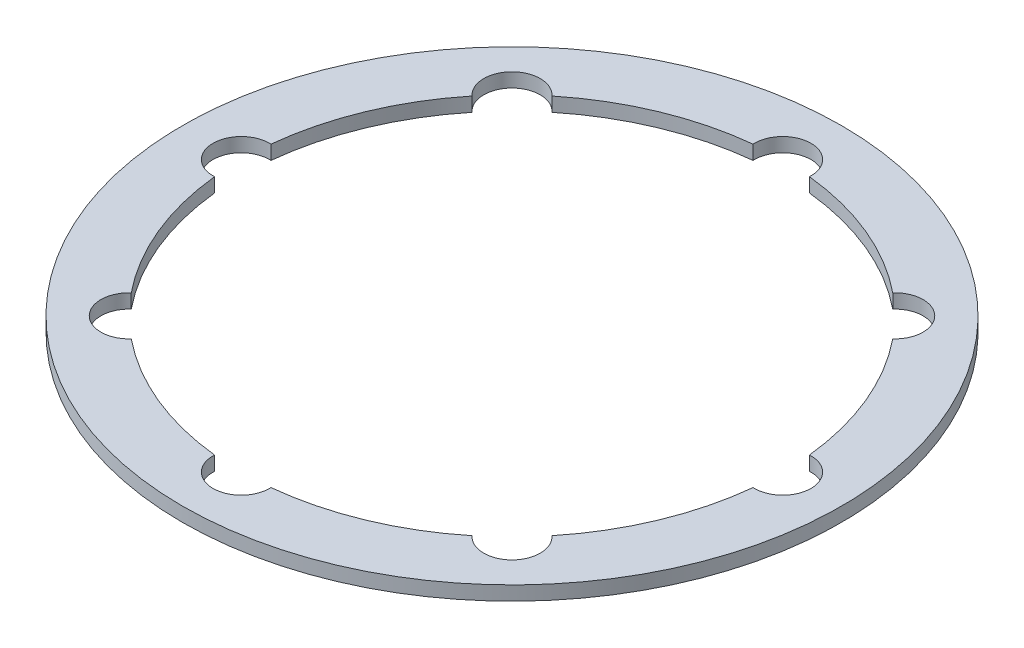
ISO-10303-21;
HEADER;
FILE_DESCRIPTION(('STEP AP214'),'2;1');
FILE_NAME('part.step','',(''),(''),'','','');
FILE_SCHEMA(('AUTOMOTIVE_DESIGN { 1 0 10303 214 1 1 1 1 }'));
ENDSEC;
DATA;
#1=APPLICATION_CONTEXT('core data for automotive mechanical design processes');
#2=APPLICATION_PROTOCOL_DEFINITION('international standard','automotive_design',2000,#1);
#3=PRODUCT_CONTEXT('',#1,'mechanical');
#4=PRODUCT('Part','Part','',(#3));
#5=PRODUCT_RELATED_PRODUCT_CATEGORY('part','',(#4));
#6=PRODUCT_DEFINITION_FORMATION('','',#4);
#7=PRODUCT_DEFINITION_CONTEXT('part definition',#1,'design');
#8=PRODUCT_DEFINITION('design','',#6,#7);
#9=PRODUCT_DEFINITION_SHAPE('','',#8);
#10=(LENGTH_UNIT() NAMED_UNIT(*) SI_UNIT(.MILLI.,.METRE.));
#11=(NAMED_UNIT(*) PLANE_ANGLE_UNIT() SI_UNIT($,.RADIAN.));
#12=(NAMED_UNIT(*) SI_UNIT($,.STERADIAN.) SOLID_ANGLE_UNIT());
#13=UNCERTAINTY_MEASURE_WITH_UNIT(LENGTH_MEASURE(1.E-05),#10,'distance_accuracy_value','');
#14=(GEOMETRIC_REPRESENTATION_CONTEXT(3) GLOBAL_UNCERTAINTY_ASSIGNED_CONTEXT((#13)) GLOBAL_UNIT_ASSIGNED_CONTEXT((#10,
#11,#12)) REPRESENTATION_CONTEXT('',''));
#15=CARTESIAN_POINT('',(0.,0.,0.));
#16=DIRECTION('',(0.,0.,1.));
#17=DIRECTION('',(1.,0.,0.));
#18=AXIS2_PLACEMENT_3D('',#15,#16,#17);
#19=CARTESIAN_POINT('',(0.,3.00000000000011,0.));
#20=DIRECTION('',(0.,1.,0.));
#21=DIRECTION('',(0.,0.,0.999999999999999));
#22=AXIS2_PLACEMENT_3D('',#19,#20,#21);
#23=PLANE('',#22);
#24=CARTESIAN_POINT('',(0.,3.00000000000011,0.));
#25=DIRECTION('',(0.,1.,0.));
#26=DIRECTION('',(0.,0.,0.999999999999999));
#27=AXIS2_PLACEMENT_3D('',#24,#25,#26);
#28=CIRCLE('',#27,70.);
#29=CARTESIAN_POINT('',(0.,3.0000000000001,-70.));
#30=VERTEX_POINT('',#29);
#31=EDGE_CURVE('E11',#30,#30,#28,.T.);
#32=ORIENTED_EDGE('',*,*,#31,.T.);
#33=EDGE_LOOP('',(#32));
#34=FACE_BOUND('',#33,.T.);
#35=CARTESIAN_POINT('',(1.3314002678122E-12,3.00000000000011,-57.4999999999968));
#36=DIRECTION('',(0.,1.,0.));
#37=DIRECTION('',(0.,0.,0.999999999999999));
#38=AXIS2_PLACEMENT_3D('',#35,#36,#37);
#39=CIRCLE('',#38,5.99999999999979);
#40=CARTESIAN_POINT('',(5.99182808337604,2.99999999999967,-57.1869565217391));
#41=VERTEX_POINT('',#40);
#42=CARTESIAN_POINT('',(-5.99182808337409,3.00000000000011,-57.1869565217393));
#43=VERTEX_POINT('',#42);
#44=EDGE_CURVE('E162',#41,#43,#39,.T.);
#45=ORIENTED_EDGE('',*,*,#44,.F.);
#46=CARTESIAN_POINT('',(0.,3.00000000000011,0.));
#47=DIRECTION('',(0.,1.,0.));
#48=DIRECTION('',(0.,0.,0.999999999999999));
#49=AXIS2_PLACEMENT_3D('',#46,#47,#48);
#50=CIRCLE('',#49,57.5);
#51=CARTESIAN_POINT('',(36.2004224824845,3.00000000000011,-44.6741470213994));
#52=VERTEX_POINT('',#51);
#53=EDGE_CURVE('E155',#52,#41,#50,.T.);
#54=ORIENTED_EDGE('',*,*,#53,.F.);
#55=CARTESIAN_POINT('',(40.6586399182254,3.00000000000011,-40.658639918224));
#56=DIRECTION('',(0.,1.,0.));
#57=DIRECTION('',(0.,0.,0.999999999999999));
#58=AXIS2_PLACEMENT_3D('',#55,#56,#57);
#59=CIRCLE('',#58,5.99999999999984);
#60=CARTESIAN_POINT('',(44.6741470214009,2.99999999999967,-36.2004224824835));
#61=VERTEX_POINT('',#60);
#62=EDGE_CURVE('E220',#61,#52,#59,.T.);
#63=ORIENTED_EDGE('',*,*,#62,.F.);
#64=CARTESIAN_POINT('',(0.,3.00000000000011,0.));
#65=DIRECTION('',(0.,1.,0.));
#66=DIRECTION('',(0.,0.,0.999999999999999));
#67=AXIS2_PLACEMENT_3D('',#64,#65,#66);
#68=CIRCLE('',#67,57.5);
#69=CARTESIAN_POINT('',(57.1869565217391,3.00000000000056,-5.9918280833744));
#70=VERTEX_POINT('',#69);
#71=EDGE_CURVE('E213',#70,#61,#68,.T.);
#72=ORIENTED_EDGE('',*,*,#71,.F.);
#73=CARTESIAN_POINT('',(57.5,3.00000000000011,-2.22044604925031E-13));
#74=DIRECTION('',(0.,1.,0.));
#75=DIRECTION('',(0.,0.,0.999999999999999));
#76=AXIS2_PLACEMENT_3D('',#73,#74,#75);
#77=CIRCLE('',#76,5.99999999999996);
#78=CARTESIAN_POINT('',(57.1869565217391,3.00000000000056,5.99182808337462));
#79=VERTEX_POINT('',#78);
#80=EDGE_CURVE('E215',#79,#70,#77,.T.);
#81=ORIENTED_EDGE('',*,*,#80,.F.);
#82=CARTESIAN_POINT('',(0.,3.00000000000011,0.));
#83=DIRECTION('',(0.,1.,0.));
#84=DIRECTION('',(0.,0.,0.999999999999999));
#85=AXIS2_PLACEMENT_3D('',#82,#83,#84);
#86=CIRCLE('',#85,57.5);
#87=CARTESIAN_POINT('',(44.6741470214011,3.00000000000011,36.2004224824826));
#88=VERTEX_POINT('',#87);
#89=EDGE_CURVE('E209',#88,#79,#86,.T.);
#90=ORIENTED_EDGE('',*,*,#89,.F.);
#91=CARTESIAN_POINT('',(40.658639918229,3.000000000001,40.6586399182258));
#92=DIRECTION('',(0.,1.,0.));
#93=DIRECTION('',(0.,0.,0.999999999999999));
#94=AXIS2_PLACEMENT_3D('',#91,#92,#93);
#95=CIRCLE('',#94,6.00000000000006);
#96=CARTESIAN_POINT('',(36.2004224824856,3.000000000001,44.674147021398));
#97=VERTEX_POINT('',#96);
#98=EDGE_CURVE('E207',#97,#88,#95,.T.);
#99=ORIENTED_EDGE('',*,*,#98,.F.);
#100=CARTESIAN_POINT('',(0.,3.00000000000011,0.));
#101=DIRECTION('',(0.,1.,0.));
#102=DIRECTION('',(0.,0.,0.999999999999999));
#103=AXIS2_PLACEMENT_3D('',#100,#101,#102);
#104=CIRCLE('',#103,57.5);
#105=CARTESIAN_POINT('',(5.99182808337971,3.000000000001,57.1869565217378));
#106=VERTEX_POINT('',#105);
#107=EDGE_CURVE('E202',#106,#97,#104,.T.);
#108=ORIENTED_EDGE('',*,*,#107,.F.);
#109=CARTESIAN_POINT('',(3.37750660772684E-12,3.00000000000011,57.4999999999983));
#110=DIRECTION('',(0.,1.,0.));
#111=DIRECTION('',(0.,0.,0.999999999999999));
#112=AXIS2_PLACEMENT_3D('',#109,#110,#111);
#113=CIRCLE('',#112,6.00000000000077);
#114=CARTESIAN_POINT('',(-5.99182808337223,3.000000000001,57.1869565217391));
#115=VERTEX_POINT('',#114);
#116=EDGE_CURVE('E197',#115,#106,#113,.T.);
#117=ORIENTED_EDGE('',*,*,#116,.F.);
#118=CARTESIAN_POINT('',(0.,3.00000000000011,0.));
#119=DIRECTION('',(0.,1.,0.));
#120=DIRECTION('',(0.,0.,0.999999999999999));
#121=AXIS2_PLACEMENT_3D('',#118,#119,#120);
#122=CIRCLE('',#121,57.5);
#123=CARTESIAN_POINT('',(-36.2004224824809,3.00000000000011,44.6741470214023));
#124=VERTEX_POINT('',#123);
#125=EDGE_CURVE('E196',#124,#115,#122,.T.);
#126=ORIENTED_EDGE('',*,*,#125,.F.);
#127=CARTESIAN_POINT('',(-40.6586399182218,2.99999999999967,40.6586399182263));
#128=DIRECTION('',(0.,1.,0.));
#129=DIRECTION('',(0.,0.,0.999999999999999));
#130=AXIS2_PLACEMENT_3D('',#127,#128,#129);
#131=CIRCLE('',#130,6.);
#132=CARTESIAN_POINT('',(-44.6741470213982,3.00000000000011,36.2004224824866));
#133=VERTEX_POINT('',#132);
#134=EDGE_CURVE('E191',#133,#124,#131,.T.);
#135=ORIENTED_EDGE('',*,*,#134,.F.);
#136=CARTESIAN_POINT('',(0.,3.00000000000011,0.));
#137=DIRECTION('',(0.,1.,0.));
#138=DIRECTION('',(0.,0.,0.999999999999999));
#139=AXIS2_PLACEMENT_3D('',#136,#137,#138);
#140=CIRCLE('',#139,57.5);
#141=CARTESIAN_POINT('',(-57.1869565217389,2.99999999999967,5.99182808337684));
#142=VERTEX_POINT('',#141);
#143=EDGE_CURVE('E192',#142,#133,#140,.T.);
#144=ORIENTED_EDGE('',*,*,#143,.F.);
#145=CARTESIAN_POINT('',(-57.4999999999953,3.00000000000011,1.99840144432528E-12));
#146=DIRECTION('',(0.,1.,0.));
#147=DIRECTION('',(0.,0.,0.999999999999999));
#148=AXIS2_PLACEMENT_3D('',#145,#146,#147);
#149=CIRCLE('',#148,6.);
#150=CARTESIAN_POINT('',(-57.1869565217393,3.00000000000011,-5.99182808337306));
#151=VERTEX_POINT('',#150);
#152=EDGE_CURVE('E189',#151,#142,#149,.T.);
#153=ORIENTED_EDGE('',*,*,#152,.F.);
#154=CARTESIAN_POINT('',(0.,3.00000000000011,0.));
#155=DIRECTION('',(0.,1.,0.));
#156=DIRECTION('',(0.,0.,0.999999999999999));
#157=AXIS2_PLACEMENT_3D('',#154,#155,#156);
#158=CIRCLE('',#157,57.5);
#159=CARTESIAN_POINT('',(-44.6741470214005,3.00000000000011,-36.2004224824837));
#160=VERTEX_POINT('',#159);
#161=EDGE_CURVE('E184',#160,#151,#158,.T.);
#162=ORIENTED_EDGE('',*,*,#161,.F.);
#163=CARTESIAN_POINT('',(-40.6586399182232,2.99999999999967,-40.6586399182234));
#164=DIRECTION('',(0.,1.,0.));
#165=DIRECTION('',(0.,0.,0.999999999999999));
#166=AXIS2_PLACEMENT_3D('',#163,#164,#165);
#167=CIRCLE('',#166,6.);
#168=CARTESIAN_POINT('',(-36.2004224824836,3.00000000000056,-44.6741470213996));
#169=VERTEX_POINT('',#168);
#170=EDGE_CURVE('E179',#169,#160,#167,.T.);
#171=ORIENTED_EDGE('',*,*,#170,.F.);
#172=CARTESIAN_POINT('',(0.,3.00000000000011,0.));
#173=DIRECTION('',(0.,1.,0.));
#174=DIRECTION('',(0.,0.,0.999999999999999));
#175=AXIS2_PLACEMENT_3D('',#172,#173,#174);
#176=CIRCLE('',#175,57.5);
#177=EDGE_CURVE('E174',#43,#169,#176,.T.);
#178=ORIENTED_EDGE('',*,*,#177,.F.);
#179=EDGE_LOOP('',(#45,#54,#63,#72,#81,#90,#99,#108,#117,#126,#135,#144,#153,#162,#171,#178));
#180=FACE_BOUND('',#179,.T.);
#181=ADVANCED_FACE('F39',(#34,#180),#23,.T.);
#182=CARTESIAN_POINT('',(0.,0.,0.));
#183=DIRECTION('',(0.,1.,0.));
#184=DIRECTION('',(0.,0.,0.999999999999999));
#185=AXIS2_PLACEMENT_3D('',#182,#183,#184);
#186=PLANE('',#185);
#187=CARTESIAN_POINT('',(0.,0.,0.));
#188=DIRECTION('',(0.,1.,0.));
#189=DIRECTION('',(0.,0.,0.999999999999999));
#190=AXIS2_PLACEMENT_3D('',#187,#188,#189);
#191=CIRCLE('',#190,70.);
#192=CARTESIAN_POINT('',(0.,0.,-70.));
#193=VERTEX_POINT('',#192);
#194=EDGE_CURVE('E43',#193,#193,#191,.T.);
#195=ORIENTED_EDGE('',*,*,#194,.F.);
#196=EDGE_LOOP('',(#195));
#197=FACE_BOUND('',#196,.T.);
#198=CARTESIAN_POINT('',(0.,0.,0.));
#199=DIRECTION('',(0.,1.,0.));
#200=DIRECTION('',(0.,0.,0.999999999999999));
#201=AXIS2_PLACEMENT_3D('',#198,#199,#200);
#202=CIRCLE('',#201,57.5);
#203=CARTESIAN_POINT('',(36.2004224824845,1.33226762955019E-12,-44.6741470214));
#204=VERTEX_POINT('',#203);
#205=CARTESIAN_POINT('',(5.99182808337604,4.44089209850063E-13,-57.1869565217393));
#206=VERTEX_POINT('',#205);
#207=EDGE_CURVE('E64',#204,#206,#202,.T.);
#208=ORIENTED_EDGE('',*,*,#207,.T.);
#209=CARTESIAN_POINT('',(1.32966554433622E-12,0.,-57.4999999999961));
#210=DIRECTION('',(0.,1.,0.));
#211=DIRECTION('',(0.,0.,0.999999999999999));
#212=AXIS2_PLACEMENT_3D('',#209,#210,#211);
#213=CIRCLE('',#212,5.99999999999979);
#214=CARTESIAN_POINT('',(-5.99182808337409,1.33226762955019E-12,-57.1869565217389));
#215=VERTEX_POINT('',#214);
#216=EDGE_CURVE('E169',#206,#215,#213,.T.);
#217=ORIENTED_EDGE('',*,*,#216,.T.);
#218=CARTESIAN_POINT('',(0.,0.,0.));
#219=DIRECTION('',(0.,1.,0.));
#220=DIRECTION('',(0.,0.,0.999999999999999));
#221=AXIS2_PLACEMENT_3D('',#218,#219,#220);
#222=CIRCLE('',#221,57.5);
#223=CARTESIAN_POINT('',(-36.2004224824836,4.44089209850063E-13,-44.6741470214003));
#224=VERTEX_POINT('',#223);
#225=EDGE_CURVE('E222',#215,#224,#222,.T.);
#226=ORIENTED_EDGE('',*,*,#225,.T.);
#227=CARTESIAN_POINT('',(-40.6586399182232,0.,-40.6586399182232));
#228=DIRECTION('',(0.,1.,0.));
#229=DIRECTION('',(0.,0.,0.999999999999999));
#230=AXIS2_PLACEMENT_3D('',#227,#228,#229);
#231=CIRCLE('',#230,6.);
#232=CARTESIAN_POINT('',(-44.6741470214005,-4.44089209850063E-13,-36.2004224824832));
#233=VERTEX_POINT('',#232);
#234=EDGE_CURVE('E230',#224,#233,#231,.T.);
#235=ORIENTED_EDGE('',*,*,#234,.T.);
#236=CARTESIAN_POINT('',(0.,0.,0.));
#237=DIRECTION('',(0.,1.,0.));
#238=DIRECTION('',(0.,0.,0.999999999999999));
#239=AXIS2_PLACEMENT_3D('',#236,#237,#238);
#240=CIRCLE('',#239,57.5);
#241=CARTESIAN_POINT('',(-57.1869565217393,0.,-5.99182808337284));
#242=VERTEX_POINT('',#241);
#243=EDGE_CURVE('E231',#233,#242,#240,.T.);
#244=ORIENTED_EDGE('',*,*,#243,.T.);
#245=CARTESIAN_POINT('',(-57.4999999999953,-4.44089209850063E-13,1.55431223447522E-12));
#246=DIRECTION('',(0.,1.,0.));
#247=DIRECTION('',(0.,0.,0.999999999999999));
#248=AXIS2_PLACEMENT_3D('',#245,#246,#247);
#249=CIRCLE('',#248,6.);
#250=CARTESIAN_POINT('',(-57.1869565217389,0.,5.99182808337706));
#251=VERTEX_POINT('',#250);
#252=EDGE_CURVE('E240',#242,#251,#249,.T.);
#253=ORIENTED_EDGE('',*,*,#252,.T.);
#254=CARTESIAN_POINT('',(0.,0.,0.));
#255=DIRECTION('',(0.,1.,0.));
#256=DIRECTION('',(0.,0.,0.999999999999999));
#257=AXIS2_PLACEMENT_3D('',#254,#255,#256);
#258=CIRCLE('',#257,57.5);
#259=CARTESIAN_POINT('',(-44.6741470213982,0.,36.2004224824859));
#260=VERTEX_POINT('',#259);
#261=EDGE_CURVE('E241',#251,#260,#258,.T.);
#262=ORIENTED_EDGE('',*,*,#261,.T.);
#263=CARTESIAN_POINT('',(-40.6586399182217,0.,40.6586399182265));
#264=DIRECTION('',(0.,1.,0.));
#265=DIRECTION('',(0.,0.,0.999999999999999));
#266=AXIS2_PLACEMENT_3D('',#263,#264,#265);
#267=CIRCLE('',#266,6.);
#268=CARTESIAN_POINT('',(-36.2004224824809,0.,44.6741470214023));
#269=VERTEX_POINT('',#268);
#270=EDGE_CURVE('E244',#260,#269,#267,.T.);
#271=ORIENTED_EDGE('',*,*,#270,.T.);
#272=CARTESIAN_POINT('',(0.,0.,0.));
#273=DIRECTION('',(0.,1.,0.));
#274=DIRECTION('',(0.,0.,0.999999999999999));
#275=AXIS2_PLACEMENT_3D('',#272,#273,#274);
#276=CIRCLE('',#275,57.5);
#277=CARTESIAN_POINT('',(-5.99182808337223,0.,57.1869565217393));
#278=VERTEX_POINT('',#277);
#279=EDGE_CURVE('E248',#269,#278,#276,.T.);
#280=ORIENTED_EDGE('',*,*,#279,.T.);
#281=CARTESIAN_POINT('',(3.37663924598886E-12,0.,57.4999999999983));
#282=DIRECTION('',(0.,1.,0.));
#283=DIRECTION('',(0.,0.,0.999999999999999));
#284=AXIS2_PLACEMENT_3D('',#281,#282,#283);
#285=CIRCLE('',#284,6.00000000000077);
#286=CARTESIAN_POINT('',(5.99182808337971,0.,57.1869565217382));
#287=VERTEX_POINT('',#286);
#288=EDGE_CURVE('E254',#278,#287,#285,.T.);
#289=ORIENTED_EDGE('',*,*,#288,.T.);
#290=CARTESIAN_POINT('',(0.,0.,0.));
#291=DIRECTION('',(0.,1.,0.));
#292=DIRECTION('',(0.,0.,0.999999999999999));
#293=AXIS2_PLACEMENT_3D('',#290,#291,#292);
#294=CIRCLE('',#293,57.5);
#295=CARTESIAN_POINT('',(36.2004224824856,1.33226762955019E-12,44.6741470213983));
#296=VERTEX_POINT('',#295);
#297=EDGE_CURVE('E260',#287,#296,#294,.T.);
#298=ORIENTED_EDGE('',*,*,#297,.T.);
#299=CARTESIAN_POINT('',(40.658639918229,4.44089209850063E-13,40.658639918226));
#300=DIRECTION('',(0.,1.,0.));
#301=DIRECTION('',(0.,0.,0.999999999999999));
#302=AXIS2_PLACEMENT_3D('',#299,#300,#301);
#303=CIRCLE('',#302,6.00000000000006);
#304=CARTESIAN_POINT('',(44.6741470214011,8.88178419700125E-13,36.2004224824832));
#305=VERTEX_POINT('',#304);
#306=EDGE_CURVE('E264',#296,#305,#303,.T.);
#307=ORIENTED_EDGE('',*,*,#306,.T.);
#308=CARTESIAN_POINT('',(0.,0.,0.));
#309=DIRECTION('',(0.,1.,0.));
#310=DIRECTION('',(0.,0.,0.999999999999999));
#311=AXIS2_PLACEMENT_3D('',#308,#309,#310);
#312=CIRCLE('',#311,57.5);
#313=CARTESIAN_POINT('',(57.1869565217391,0.,5.99182808337506));
#314=VERTEX_POINT('',#313);
#315=EDGE_CURVE('E262',#305,#314,#312,.T.);
#316=ORIENTED_EDGE('',*,*,#315,.T.);
#317=CARTESIAN_POINT('',(57.5,0.,0.));
#318=DIRECTION('',(0.,1.,0.));
#319=DIRECTION('',(0.,0.,0.999999999999999));
#320=AXIS2_PLACEMENT_3D('',#317,#318,#319);
#321=CIRCLE('',#320,5.99999999999996);
#322=CARTESIAN_POINT('',(57.1869565217391,8.88178419700125E-13,-5.99182808337417));
#323=VERTEX_POINT('',#322);
#324=EDGE_CURVE('E268',#314,#323,#321,.T.);
#325=ORIENTED_EDGE('',*,*,#324,.T.);
#326=CARTESIAN_POINT('',(0.,0.,0.));
#327=DIRECTION('',(0.,1.,0.));
#328=DIRECTION('',(0.,0.,0.999999999999999));
#329=AXIS2_PLACEMENT_3D('',#326,#327,#328);
#330=CIRCLE('',#329,57.5);
#331=CARTESIAN_POINT('',(44.6741470214009,0.,-36.2004224824828));
#332=VERTEX_POINT('',#331);
#333=EDGE_CURVE('E271',#323,#332,#330,.T.);
#334=ORIENTED_EDGE('',*,*,#333,.T.);
#335=CARTESIAN_POINT('',(40.6586399182254,0.,-40.6586399182238));
#336=DIRECTION('',(0.,1.,0.));
#337=DIRECTION('',(0.,0.,0.999999999999999));
#338=AXIS2_PLACEMENT_3D('',#335,#336,#337);
#339=CIRCLE('',#338,5.99999999999984);
#340=EDGE_CURVE('E161',#332,#204,#339,.T.);
#341=ORIENTED_EDGE('',*,*,#340,.T.);
#342=EDGE_LOOP('',(#208,#217,#226,#235,#244,#253,#262,#271,#280,#289,#298,#307,#316,#325,#334,#341));
#343=FACE_BOUND('',#342,.T.);
#344=ADVANCED_FACE('F330',(#197,#343),#186,.F.);
#345=CARTESIAN_POINT('',(0.,3.00000000000011,0.));
#346=DIRECTION('',(0.,-1.,0.));
#347=DIRECTION('',(0.,0.,-0.999999999999999));
#348=AXIS2_PLACEMENT_3D('',#345,#346,#347);
#349=CYLINDRICAL_SURFACE('',#348,70.);
#350=CARTESIAN_POINT('',(0.,3.0000000000001,-70.));
#351=CARTESIAN_POINT('',(0.,2.9687500000001,-70.));
#352=CARTESIAN_POINT('',(0.,2.9375000000001,-70.));
#353=CARTESIAN_POINT('',(0.,2.87500000000009,-70.));
#354=CARTESIAN_POINT('',(0.,2.84375000000009,-70.));
#355=CARTESIAN_POINT('',(0.,2.78125000000009,-70.));
#356=CARTESIAN_POINT('',(0.,2.75000000000009,-70.));
#357=CARTESIAN_POINT('',(0.,2.68750000000009,-70.));
#358=CARTESIAN_POINT('',(0.,2.65625000000009,-70.));
#359=CARTESIAN_POINT('',(0.,2.59375000000008,-70.));
#360=CARTESIAN_POINT('',(0.,2.56250000000008,-70.));
#361=CARTESIAN_POINT('',(0.,2.50000000000008,-70.));
#362=CARTESIAN_POINT('',(0.,2.46875000000008,-70.));
#363=CARTESIAN_POINT('',(0.,2.40625000000008,-70.));
#364=CARTESIAN_POINT('',(0.,2.37500000000007,-70.));
#365=CARTESIAN_POINT('',(0.,2.31250000000007,-70.));
#366=CARTESIAN_POINT('',(0.,2.28125000000007,-70.));
#367=CARTESIAN_POINT('',(0.,2.21875000000007,-70.));
#368=CARTESIAN_POINT('',(0.,2.18750000000007,-70.));
#369=CARTESIAN_POINT('',(0.,2.12500000000006,-70.));
#370=CARTESIAN_POINT('',(0.,2.09375000000006,-70.));
#371=CARTESIAN_POINT('',(0.,2.03125000000006,-70.));
#372=CARTESIAN_POINT('',(0.,2.00000000000006,-70.));
#373=CARTESIAN_POINT('',(0.,1.93750000000006,-70.));
#374=CARTESIAN_POINT('',(0.,1.90625000000006,-70.));
#375=CARTESIAN_POINT('',(0.,1.84375000000005,-70.));
#376=CARTESIAN_POINT('',(0.,1.81250000000005,-70.));
#377=CARTESIAN_POINT('',(0.,1.75000000000005,-70.));
#378=CARTESIAN_POINT('',(0.,1.71875000000005,-70.));
#379=CARTESIAN_POINT('',(0.,1.65625000000005,-70.));
#380=CARTESIAN_POINT('',(0.,1.62500000000005,-70.));
#381=CARTESIAN_POINT('',(0.,1.56250000000004,-70.));
#382=CARTESIAN_POINT('',(0.,1.53125000000004,-70.));
#383=CARTESIAN_POINT('',(0.,1.46875000000004,-70.));
#384=CARTESIAN_POINT('',(0.,1.43750000000004,-70.));
#385=CARTESIAN_POINT('',(0.,1.37500000000004,-70.));
#386=CARTESIAN_POINT('',(0.,1.34375000000004,-70.));
#387=CARTESIAN_POINT('',(0.,1.28125000000003,-70.));
#388=CARTESIAN_POINT('',(0.,1.25000000000003,-70.));
#389=CARTESIAN_POINT('',(0.,1.18750000000003,-70.));
#390=CARTESIAN_POINT('',(0.,1.15625000000003,-70.));
#391=CARTESIAN_POINT('',(0.,1.09375000000003,-70.));
#392=CARTESIAN_POINT('',(0.,1.06250000000003,-70.));
#393=CARTESIAN_POINT('',(0.,1.00000000000002,-70.));
#394=CARTESIAN_POINT('',(0.,0.968750000000022,-70.));
#395=CARTESIAN_POINT('',(0.,0.906250000000019,-70.));
#396=CARTESIAN_POINT('',(0.,0.875000000000018,-70.));
#397=CARTESIAN_POINT('',(0.,0.812500000000016,-70.));
#398=CARTESIAN_POINT('',(0.,0.781250000000014,-70.));
#399=CARTESIAN_POINT('',(0.,0.718750000000012,-70.));
#400=CARTESIAN_POINT('',(0.,0.687500000000011,-70.));
#401=CARTESIAN_POINT('',(0.,0.625000000000008,-70.));
#402=CARTESIAN_POINT('',(0.,0.593750000000007,-70.));
#403=CARTESIAN_POINT('',(0.,0.531250000000005,-70.));
#404=CARTESIAN_POINT('',(0.,0.500000000000003,-70.));
#405=CARTESIAN_POINT('',(0.,0.437500000000001,-70.));
#406=CARTESIAN_POINT('',(0.,0.40625,-70.));
#407=CARTESIAN_POINT('',(0.,0.343749999999997,-70.));
#408=CARTESIAN_POINT('',(0.,0.312499999999996,-70.));
#409=CARTESIAN_POINT('',(0.,0.249999999999994,-70.));
#410=CARTESIAN_POINT('',(0.,0.218749999999993,-70.));
#411=CARTESIAN_POINT('',(0.,0.15624999999999,-70.));
#412=CARTESIAN_POINT('',(0.,0.124999999999989,-70.));
#413=CARTESIAN_POINT('',(0.,0.0624999999999868,-70.));
#414=CARTESIAN_POINT('',(0.,0.0312499999999856,-70.));
#415=CARTESIAN_POINT('',(0.,0.,-70.));
#416=B_SPLINE_CURVE_WITH_KNOTS('',3,(#350,#351,#352,#353,#354,#355,#356,#357,#358,#359,#360,
#361,#362,#363,#364,#365,#366,#367,#368,#369,#370,#371,#372,#373,#374,#375,#376,#377,#378,#379,
#380,#381,#382,#383,#384,#385,#386,#387,#388,#389,#390,#391,#392,#393,#394,#395,#396,#397,#398,
#399,#400,#401,#402,#403,#404,#405,#406,#407,#408,#409,#410,#411,#412,#413,#414,#415),
.UNSPECIFIED.,.F.,.F.,(4,2,2,2,2,2,2,2,2,2,2,2,2,2,2,2,2,2,2,2,2,2,2,2,2,2,2,2,2,2,2,2,4),(0.,
0.093750000000004,0.187500000000008,0.281250000000011,0.375000000000015,0.468750000000018,
0.562500000000022,0.656250000000025,0.750000000000029,0.843750000000032,0.937500000000036,
1.03125000000004,1.12500000000004,1.21875000000005,1.31250000000005,1.40625000000005,
1.50000000000006,1.59375000000006,1.68750000000006,1.78125000000007,1.87500000000007,
1.96875000000007,2.06250000000008,2.15625000000008,2.25000000000009,2.34375000000009,
2.43750000000009,2.5312500000001,2.6250000000001,2.7187500000001,2.81250000000011,
2.90625000000011,3.00000000000011),.UNSPECIFIED.);
#417=EDGE_CURVE('BSEAM41',#30,#193,#416,.T.);
#418=ORIENTED_EDGE('',*,*,#31,.F.);
#419=ORIENTED_EDGE('',*,*,#194,.T.);
#420=ORIENTED_EDGE('',*,*,#417,.T.);
#421=ORIENTED_EDGE('',*,*,#417,.F.);
#422=EDGE_LOOP('',(#418,#420,#419,#421));
#423=FACE_BOUND('',#422,.T.);
#424=ADVANCED_FACE('F41',(#423),#349,.T.);
#425=CARTESIAN_POINT('',(0.,3.00000000000011,0.));
#426=DIRECTION('',(0.,-1.,0.));
#427=DIRECTION('',(0.,0.,-0.999999999999999));
#428=AXIS2_PLACEMENT_3D('',#425,#426,#427);
#429=CYLINDRICAL_SURFACE('',#428,57.5);
#430=ORIENTED_EDGE('',*,*,#207,.F.);
#431=DIRECTION('',(0.,-1.,0.));
#432=VECTOR('',#431,1.);
#433=CARTESIAN_POINT('',(36.2004224824845,3.00000000000011,-44.6741470213994));
#434=LINE('',#433,#432);
#435=EDGE_CURVE('E156',#52,#204,#434,.T.);
#436=ORIENTED_EDGE('',*,*,#435,.F.);
#437=ORIENTED_EDGE('',*,*,#53,.T.);
#438=DIRECTION('',(0.,-1.,0.));
#439=VECTOR('',#438,1.);
#440=CARTESIAN_POINT('',(5.99182808337604,2.99999999999967,-57.1869565217391));
#441=LINE('',#440,#439);
#442=EDGE_CURVE('E159',#41,#206,#441,.T.);
#443=ORIENTED_EDGE('',*,*,#442,.T.);
#444=EDGE_LOOP('',(#430,#436,#437,#443));
#445=FACE_BOUND('',#444,.T.);
#446=ADVANCED_FACE('F152',(#445),#429,.F.);
#447=CARTESIAN_POINT('',(1.3314002678122E-12,3.00000000000011,-57.4999999999968));
#448=DIRECTION('',(0.,-1.,0.));
#449=DIRECTION('',(0.,0.,-0.999999999999999));
#450=AXIS2_PLACEMENT_3D('',#447,#448,#449);
#451=CYLINDRICAL_SURFACE('',#450,5.99999999999979);
#452=ORIENTED_EDGE('',*,*,#216,.F.);
#453=ORIENTED_EDGE('',*,*,#442,.F.);
#454=ORIENTED_EDGE('',*,*,#44,.T.);
#455=DIRECTION('',(0.,-1.,0.));
#456=VECTOR('',#455,1.);
#457=CARTESIAN_POINT('',(-5.99182808337409,3.00000000000011,-57.1869565217393));
#458=LINE('',#457,#456);
#459=EDGE_CURVE('E171',#43,#215,#458,.T.);
#460=ORIENTED_EDGE('',*,*,#459,.T.);
#461=EDGE_LOOP('',(#452,#453,#454,#460));
#462=FACE_BOUND('',#461,.T.);
#463=ADVANCED_FACE('F168',(#462),#451,.F.);
#464=CARTESIAN_POINT('',(0.,3.00000000000011,0.));
#465=DIRECTION('',(0.,-1.,0.));
#466=DIRECTION('',(0.,0.,-0.999999999999999));
#467=AXIS2_PLACEMENT_3D('',#464,#465,#466);
#468=CYLINDRICAL_SURFACE('',#467,57.5);
#469=ORIENTED_EDGE('',*,*,#225,.F.);
#470=ORIENTED_EDGE('',*,*,#459,.F.);
#471=ORIENTED_EDGE('',*,*,#177,.T.);
#472=DIRECTION('',(0.,-1.,0.));
#473=VECTOR('',#472,1.);
#474=CARTESIAN_POINT('',(-36.2004224824836,3.00000000000056,-44.6741470213996));
#475=LINE('',#474,#473);
#476=EDGE_CURVE('E320',#169,#224,#475,.T.);
#477=ORIENTED_EDGE('',*,*,#476,.T.);
#478=EDGE_LOOP('',(#469,#470,#471,#477));
#479=FACE_BOUND('',#478,.T.);
#480=ADVANCED_FACE('F321',(#479),#468,.F.);
#481=CARTESIAN_POINT('',(-40.6586399182232,2.99999999999967,-40.6586399182234));
#482=DIRECTION('',(0.,-1.,0.));
#483=DIRECTION('',(0.,0.,-0.999999999999999));
#484=AXIS2_PLACEMENT_3D('',#481,#482,#483);
#485=CYLINDRICAL_SURFACE('',#484,6.);
#486=ORIENTED_EDGE('',*,*,#234,.F.);
#487=ORIENTED_EDGE('',*,*,#476,.F.);
#488=ORIENTED_EDGE('',*,*,#170,.T.);
#489=DIRECTION('',(0.,-1.,0.));
#490=VECTOR('',#489,1.);
#491=CARTESIAN_POINT('',(-44.6741470214005,3.00000000000011,-36.2004224824837));
#492=LINE('',#491,#490);
#493=EDGE_CURVE('E313',#160,#233,#492,.T.);
#494=ORIENTED_EDGE('',*,*,#493,.T.);
#495=EDGE_LOOP('',(#486,#487,#488,#494));
#496=FACE_BOUND('',#495,.T.);
#497=ADVANCED_FACE('F387',(#496),#485,.F.);
#498=CARTESIAN_POINT('',(0.,3.00000000000011,0.));
#499=DIRECTION('',(0.,-1.,0.));
#500=DIRECTION('',(0.,0.,-0.999999999999999));
#501=AXIS2_PLACEMENT_3D('',#498,#499,#500);
#502=CYLINDRICAL_SURFACE('',#501,57.5);
#503=ORIENTED_EDGE('',*,*,#243,.F.);
#504=ORIENTED_EDGE('',*,*,#493,.F.);
#505=ORIENTED_EDGE('',*,*,#161,.T.);
#506=DIRECTION('',(0.,-1.,0.));
#507=VECTOR('',#506,1.);
#508=CARTESIAN_POINT('',(-57.1869565217393,3.00000000000011,-5.99182808337306));
#509=LINE('',#508,#507);
#510=EDGE_CURVE('E311',#151,#242,#509,.T.);
#511=ORIENTED_EDGE('',*,*,#510,.T.);
#512=EDGE_LOOP('',(#503,#504,#505,#511));
#513=FACE_BOUND('',#512,.T.);
#514=ADVANCED_FACE('F384',(#513),#502,.F.);
#515=CARTESIAN_POINT('',(-57.4999999999953,3.00000000000011,1.99840144432528E-12));
#516=DIRECTION('',(0.,-1.,0.));
#517=DIRECTION('',(0.,0.,-0.999999999999999));
#518=AXIS2_PLACEMENT_3D('',#515,#516,#517);
#519=CYLINDRICAL_SURFACE('',#518,6.);
#520=ORIENTED_EDGE('',*,*,#252,.F.);
#521=ORIENTED_EDGE('',*,*,#510,.F.);
#522=ORIENTED_EDGE('',*,*,#152,.T.);
#523=DIRECTION('',(0.,-1.,0.));
#524=VECTOR('',#523,1.);
#525=CARTESIAN_POINT('',(-57.1869565217389,2.99999999999967,5.99182808337684));
#526=LINE('',#525,#524);
#527=EDGE_CURVE('E308',#142,#251,#526,.T.);
#528=ORIENTED_EDGE('',*,*,#527,.T.);
#529=EDGE_LOOP('',(#520,#521,#522,#528));
#530=FACE_BOUND('',#529,.T.);
#531=ADVANCED_FACE('F379',(#530),#519,.F.);
#532=CARTESIAN_POINT('',(0.,3.00000000000011,0.));
#533=DIRECTION('',(0.,-1.,0.));
#534=DIRECTION('',(0.,0.,-0.999999999999999));
#535=AXIS2_PLACEMENT_3D('',#532,#533,#534);
#536=CYLINDRICAL_SURFACE('',#535,57.5);
#537=ORIENTED_EDGE('',*,*,#261,.F.);
#538=ORIENTED_EDGE('',*,*,#527,.F.);
#539=ORIENTED_EDGE('',*,*,#143,.T.);
#540=DIRECTION('',(0.,-1.,0.));
#541=VECTOR('',#540,1.);
#542=CARTESIAN_POINT('',(-44.6741470213982,3.00000000000011,36.2004224824866));
#543=LINE('',#542,#541);
#544=EDGE_CURVE('E304',#133,#260,#543,.T.);
#545=ORIENTED_EDGE('',*,*,#544,.T.);
#546=EDGE_LOOP('',(#537,#538,#539,#545));
#547=FACE_BOUND('',#546,.T.);
#548=ADVANCED_FACE('F373',(#547),#536,.F.);
#549=CARTESIAN_POINT('',(-40.6586399182218,2.99999999999967,40.6586399182263));
#550=DIRECTION('',(0.,-1.,0.));
#551=DIRECTION('',(0.,0.,-0.999999999999999));
#552=AXIS2_PLACEMENT_3D('',#549,#550,#551);
#553=CYLINDRICAL_SURFACE('',#552,6.);
#554=ORIENTED_EDGE('',*,*,#270,.F.);
#555=ORIENTED_EDGE('',*,*,#544,.F.);
#556=ORIENTED_EDGE('',*,*,#134,.T.);
#557=DIRECTION('',(0.,-1.,0.));
#558=VECTOR('',#557,1.);
#559=CARTESIAN_POINT('',(-36.2004224824809,3.00000000000011,44.6741470214023));
#560=LINE('',#559,#558);
#561=EDGE_CURVE('E305',#124,#269,#560,.T.);
#562=ORIENTED_EDGE('',*,*,#561,.T.);
#563=EDGE_LOOP('',(#554,#555,#556,#562));
#564=FACE_BOUND('',#563,.T.);
#565=ADVANCED_FACE('F367',(#564),#553,.F.);
#566=CARTESIAN_POINT('',(0.,3.00000000000011,0.));
#567=DIRECTION('',(0.,-1.,0.));
#568=DIRECTION('',(0.,0.,-0.999999999999999));
#569=AXIS2_PLACEMENT_3D('',#566,#567,#568);
#570=CYLINDRICAL_SURFACE('',#569,57.5);
#571=ORIENTED_EDGE('',*,*,#279,.F.);
#572=ORIENTED_EDGE('',*,*,#561,.F.);
#573=ORIENTED_EDGE('',*,*,#125,.T.);
#574=DIRECTION('',(0.,-1.,0.));
#575=VECTOR('',#574,1.);
#576=CARTESIAN_POINT('',(-5.99182808337223,3.000000000001,57.1869565217391));
#577=LINE('',#576,#575);
#578=EDGE_CURVE('E299',#115,#278,#577,.T.);
#579=ORIENTED_EDGE('',*,*,#578,.T.);
#580=EDGE_LOOP('',(#571,#572,#573,#579));
#581=FACE_BOUND('',#580,.T.);
#582=ADVANCED_FACE('F366',(#581),#570,.F.);
#583=CARTESIAN_POINT('',(3.37750660772684E-12,3.00000000000011,57.4999999999983));
#584=DIRECTION('',(0.,-1.,0.));
#585=DIRECTION('',(0.,0.,-0.999999999999999));
#586=AXIS2_PLACEMENT_3D('',#583,#584,#585);
#587=CYLINDRICAL_SURFACE('',#586,6.00000000000077);
#588=ORIENTED_EDGE('',*,*,#288,.F.);
#589=ORIENTED_EDGE('',*,*,#578,.F.);
#590=ORIENTED_EDGE('',*,*,#116,.T.);
#591=DIRECTION('',(0.,-1.,0.));
#592=VECTOR('',#591,1.);
#593=CARTESIAN_POINT('',(5.99182808337971,3.000000000001,57.1869565217378));
#594=LINE('',#593,#592);
#595=EDGE_CURVE('E298',#106,#287,#594,.T.);
#596=ORIENTED_EDGE('',*,*,#595,.T.);
#597=EDGE_LOOP('',(#588,#589,#590,#596));
#598=FACE_BOUND('',#597,.T.);
#599=ADVANCED_FACE('F356',(#598),#587,.F.);
#600=CARTESIAN_POINT('',(0.,3.00000000000011,0.));
#601=DIRECTION('',(0.,-1.,0.));
#602=DIRECTION('',(0.,0.,-0.999999999999999));
#603=AXIS2_PLACEMENT_3D('',#600,#601,#602);
#604=CYLINDRICAL_SURFACE('',#603,57.5);
#605=ORIENTED_EDGE('',*,*,#297,.F.);
#606=ORIENTED_EDGE('',*,*,#595,.F.);
#607=ORIENTED_EDGE('',*,*,#107,.T.);
#608=DIRECTION('',(0.,-1.,0.));
#609=VECTOR('',#608,1.);
#610=CARTESIAN_POINT('',(36.2004224824856,3.000000000001,44.674147021398));
#611=LINE('',#610,#609);
#612=EDGE_CURVE('E291',#97,#296,#611,.T.);
#613=ORIENTED_EDGE('',*,*,#612,.T.);
#614=EDGE_LOOP('',(#605,#606,#607,#613));
#615=FACE_BOUND('',#614,.T.);
#616=ADVANCED_FACE('F353',(#615),#604,.F.);
#617=CARTESIAN_POINT('',(40.658639918229,3.000000000001,40.6586399182258));
#618=DIRECTION('',(0.,-1.,0.));
#619=DIRECTION('',(0.,0.,-0.999999999999999));
#620=AXIS2_PLACEMENT_3D('',#617,#618,#619);
#621=CYLINDRICAL_SURFACE('',#620,6.00000000000006);
#622=ORIENTED_EDGE('',*,*,#306,.F.);
#623=ORIENTED_EDGE('',*,*,#612,.F.);
#624=ORIENTED_EDGE('',*,*,#98,.T.);
#625=DIRECTION('',(0.,-1.,0.));
#626=VECTOR('',#625,1.);
#627=CARTESIAN_POINT('',(44.6741470214011,3.00000000000011,36.2004224824826));
#628=LINE('',#627,#626);
#629=EDGE_CURVE('E287',#88,#305,#628,.T.);
#630=ORIENTED_EDGE('',*,*,#629,.T.);
#631=EDGE_LOOP('',(#622,#623,#624,#630));
#632=FACE_BOUND('',#631,.T.);
#633=ADVANCED_FACE('F354',(#632),#621,.F.);
#634=CARTESIAN_POINT('',(0.,3.00000000000011,0.));
#635=DIRECTION('',(0.,-1.,0.));
#636=DIRECTION('',(0.,0.,-0.999999999999999));
#637=AXIS2_PLACEMENT_3D('',#634,#635,#636);
#638=CYLINDRICAL_SURFACE('',#637,57.5);
#639=ORIENTED_EDGE('',*,*,#315,.F.);
#640=ORIENTED_EDGE('',*,*,#629,.F.);
#641=ORIENTED_EDGE('',*,*,#89,.T.);
#642=DIRECTION('',(0.,-1.,0.));
#643=VECTOR('',#642,1.);
#644=CARTESIAN_POINT('',(57.1869565217391,3.00000000000056,5.99182808337462));
#645=LINE('',#644,#643);
#646=EDGE_CURVE('E286',#79,#314,#645,.T.);
#647=ORIENTED_EDGE('',*,*,#646,.T.);
#648=EDGE_LOOP('',(#639,#640,#641,#647));
#649=FACE_BOUND('',#648,.T.);
#650=ADVANCED_FACE('F344',(#649),#638,.F.);
#651=CARTESIAN_POINT('',(57.5,3.00000000000011,-2.22044604925031E-13));
#652=DIRECTION('',(0.,-1.,0.));
#653=DIRECTION('',(0.,0.,-0.999999999999999));
#654=AXIS2_PLACEMENT_3D('',#651,#652,#653);
#655=CYLINDRICAL_SURFACE('',#654,5.99999999999996);
#656=ORIENTED_EDGE('',*,*,#324,.F.);
#657=ORIENTED_EDGE('',*,*,#646,.F.);
#658=ORIENTED_EDGE('',*,*,#80,.T.);
#659=DIRECTION('',(0.,-1.,0.));
#660=VECTOR('',#659,1.);
#661=CARTESIAN_POINT('',(57.1869565217391,3.00000000000056,-5.9918280833744));
#662=LINE('',#661,#660);
#663=EDGE_CURVE('E283',#70,#323,#662,.T.);
#664=ORIENTED_EDGE('',*,*,#663,.T.);
#665=EDGE_LOOP('',(#656,#657,#658,#664));
#666=FACE_BOUND('',#665,.T.);
#667=ADVANCED_FACE('F339',(#666),#655,.F.);
#668=CARTESIAN_POINT('',(0.,3.00000000000011,0.));
#669=DIRECTION('',(0.,-1.,0.));
#670=DIRECTION('',(0.,0.,-0.999999999999999));
#671=AXIS2_PLACEMENT_3D('',#668,#669,#670);
#672=CYLINDRICAL_SURFACE('',#671,57.5);
#673=ORIENTED_EDGE('',*,*,#333,.F.);
#674=ORIENTED_EDGE('',*,*,#663,.F.);
#675=ORIENTED_EDGE('',*,*,#71,.T.);
#676=DIRECTION('',(0.,-1.,0.));
#677=VECTOR('',#676,1.);
#678=CARTESIAN_POINT('',(44.6741470214009,2.99999999999967,-36.2004224824835));
#679=LINE('',#678,#677);
#680=EDGE_CURVE('E54',#61,#332,#679,.T.);
#681=ORIENTED_EDGE('',*,*,#680,.T.);
#682=EDGE_LOOP('',(#673,#674,#675,#681));
#683=FACE_BOUND('',#682,.T.);
#684=ADVANCED_FACE('F337',(#683),#672,.F.);
#685=CARTESIAN_POINT('',(40.6586399182254,3.00000000000011,-40.658639918224));
#686=DIRECTION('',(0.,-1.,0.));
#687=DIRECTION('',(0.,0.,-0.999999999999999));
#688=AXIS2_PLACEMENT_3D('',#685,#686,#687);
#689=CYLINDRICAL_SURFACE('',#688,5.99999999999984);
#690=ORIENTED_EDGE('',*,*,#340,.F.);
#691=ORIENTED_EDGE('',*,*,#680,.F.);
#692=ORIENTED_EDGE('',*,*,#62,.T.);
#693=ORIENTED_EDGE('',*,*,#435,.T.);
#694=EDGE_LOOP('',(#690,#691,#692,#693));
#695=FACE_BOUND('',#694,.T.);
#696=ADVANCED_FACE('F327',(#695),#689,.F.);
#697=CLOSED_SHELL('',(#181,#344,#424,#446,#463,#480,#497,#514,#531,#548,#565,#582,#599,#616,
#633,#650,#667,#684,#696));
#698=MANIFOLD_SOLID_BREP('B2',#697);
#699=ADVANCED_BREP_SHAPE_REPRESENTATION('',(#18,#698),#14);
#700=SHAPE_DEFINITION_REPRESENTATION(#9,#699);
ENDSEC;
END-ISO-10303-21;
